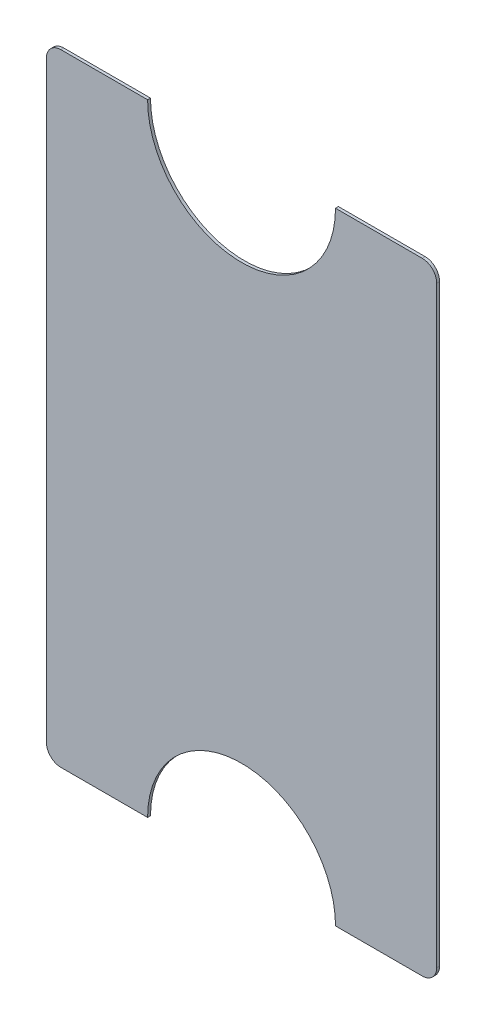
ISO-10303-21;
HEADER;
FILE_DESCRIPTION(('STEP AP214'),'2;1');
FILE_NAME('part.step','',(''),(''),'','','');
FILE_SCHEMA(('AUTOMOTIVE_DESIGN { 1 0 10303 214 1 1 1 1 }'));
ENDSEC;
DATA;
#1=APPLICATION_CONTEXT('core data for automotive mechanical design processes');
#2=APPLICATION_PROTOCOL_DEFINITION('international standard','automotive_design',2000,#1);
#3=PRODUCT_CONTEXT('',#1,'mechanical');
#4=PRODUCT('Part','Part','',(#3));
#5=PRODUCT_RELATED_PRODUCT_CATEGORY('part','',(#4));
#6=PRODUCT_DEFINITION_FORMATION('','',#4);
#7=PRODUCT_DEFINITION_CONTEXT('part definition',#1,'design');
#8=PRODUCT_DEFINITION('design','',#6,#7);
#9=PRODUCT_DEFINITION_SHAPE('','',#8);
#10=(LENGTH_UNIT() NAMED_UNIT(*) SI_UNIT(.MILLI.,.METRE.));
#11=(NAMED_UNIT(*) PLANE_ANGLE_UNIT() SI_UNIT($,.RADIAN.));
#12=(NAMED_UNIT(*) SI_UNIT($,.STERADIAN.) SOLID_ANGLE_UNIT());
#13=UNCERTAINTY_MEASURE_WITH_UNIT(LENGTH_MEASURE(1.E-05),#10,'distance_accuracy_value','');
#14=(GEOMETRIC_REPRESENTATION_CONTEXT(3) GLOBAL_UNCERTAINTY_ASSIGNED_CONTEXT((#13)) GLOBAL_UNIT_ASSIGNED_CONTEXT((#10,
#11,#12)) REPRESENTATION_CONTEXT('',''));
#15=CARTESIAN_POINT('',(0.,0.,0.));
#16=DIRECTION('',(0.,0.,1.));
#17=DIRECTION('',(1.,0.,0.));
#18=AXIS2_PLACEMENT_3D('',#15,#16,#17);
#19=CARTESIAN_POINT('',(-4.824993047503,-5.083004273851,0.43));
#20=DIRECTION('',(0.,0.,1.));
#21=DIRECTION('',(1.,0.,0.));
#22=AXIS2_PLACEMENT_3D('',#19,#20,#21);
#23=PLANE('',#22);
#24=CARTESIAN_POINT('',(-6.124993018382,-7.525000667453,0.43));
#25=DIRECTION('',(0.,0.,1.));
#26=DIRECTION('',(1.,0.,0.));
#27=AXIS2_PLACEMENT_3D('',#24,#25,#26);
#28=CIRCLE('',#27,0.05);
#29=CARTESIAN_POINT('',(-6.12499301778588,-7.57500066745288,0.43));
#30=VERTEX_POINT('',#29);
#31=CARTESIAN_POINT('',(-6.17499301838275,-7.52500066804912,0.43));
#32=VERTEX_POINT('',#31);
#33=EDGE_CURVE('E170',#30,#32,#28,.F.);
#34=ORIENTED_EDGE('',*,*,#33,.F.);
#35=DIRECTION('',(1.,1.19248806385E-08,0.));
#36=VECTOR('',#35,1.);
#37=CARTESIAN_POINT('',(-6.174993017786,-7.575000668049,0.43));
#38=LINE('',#37,#36);
#39=CARTESIAN_POINT('',(-5.824993017786,-7.57500066387529,0.43));
#40=VERTEX_POINT('',#39);
#41=EDGE_CURVE('E138',#40,#30,#38,.F.);
#42=ORIENTED_EDGE('',*,*,#41,.F.);
#43=CARTESIAN_POINT('',(-5.499993017786,-7.57500066,0.43));
#44=DIRECTION('',(0.,0.,1.));
#45=DIRECTION('',(1.,0.,0.));
#46=AXIS2_PLACEMENT_3D('',#43,#44,#45);
#47=CIRCLE('',#46,0.325);
#48=CARTESIAN_POINT('',(-5.174993017786,-7.57500065612406,0.43));
#49=VERTEX_POINT('',#48);
#50=EDGE_CURVE('E108',#40,#49,#47,.F.);
#51=ORIENTED_EDGE('',*,*,#50,.T.);
#52=DIRECTION('',(1.,0.,0.));
#53=VECTOR('',#52,1.);
#54=CARTESIAN_POINT('',(-4.824993047503,-7.575000656124,0.43));
#55=LINE('',#54,#53);
#56=CARTESIAN_POINT('',(-4.874993018084,-7.57500065433533,0.43));
#57=VERTEX_POINT('',#56);
#58=EDGE_CURVE('E109',#49,#57,#55,.T.);
#59=ORIENTED_EDGE('',*,*,#58,.T.);
#60=CARTESIAN_POINT('',(-4.874993018382,-7.525000652547,0.43));
#61=DIRECTION('',(0.,0.,1.));
#62=DIRECTION('',(1.,0.,0.));
#63=AXIS2_PLACEMENT_3D('',#60,#61,#62);
#64=CIRCLE('',#63,0.05);
#65=CARTESIAN_POINT('',(-4.82499301838212,-7.52500065224888,0.43));
#66=VERTEX_POINT('',#65);
#67=EDGE_CURVE('E20',#57,#66,#64,.T.);
#68=ORIENTED_EDGE('',*,*,#67,.T.);
#69=DIRECTION('',(-1.19248806385E-08,1.,0.));
#70=VECTOR('',#69,1.);
#71=CARTESIAN_POINT('',(-4.824993017786,-7.575000651951,0.43));
#72=LINE('',#71,#70);
#73=CARTESIAN_POINT('',(-4.82499304282825,-5.47500065195088,0.43));
#74=VERTEX_POINT('',#73);
#75=EDGE_CURVE('E124',#74,#66,#72,.F.);
#76=ORIENTED_EDGE('',*,*,#75,.F.);
#77=CARTESIAN_POINT('',(-4.874993042828,-5.475000652547,0.43));
#78=DIRECTION('',(0.,0.,1.));
#79=DIRECTION('',(1.,0.,0.));
#80=AXIS2_PLACEMENT_3D('',#77,#78,#79);
#81=CIRCLE('',#80,0.05);
#82=CARTESIAN_POINT('',(-4.87499304342462,-5.42500065254712,0.43));
#83=VERTEX_POINT('',#82);
#84=EDGE_CURVE('E162',#83,#74,#81,.F.);
#85=ORIENTED_EDGE('',*,*,#84,.F.);
#86=DIRECTION('',(-1.,-1.19248806385E-08,0.));
#87=VECTOR('',#86,1.);
#88=CARTESIAN_POINT('',(-4.824993043425,-5.425000651951,0.43));
#89=LINE('',#88,#87);
#90=CARTESIAN_POINT('',(-5.174993043425,-5.42500065612471,0.43));
#91=VERTEX_POINT('',#90);
#92=EDGE_CURVE('E126',#91,#83,#89,.F.);
#93=ORIENTED_EDGE('',*,*,#92,.F.);
#94=CARTESIAN_POINT('',(-5.499993043425,-5.42500066,0.43));
#95=DIRECTION('',(0.,0.,1.));
#96=DIRECTION('',(1.,0.,0.));
#97=AXIS2_PLACEMENT_3D('',#94,#95,#96);
#98=CIRCLE('',#97,0.325);
#99=CARTESIAN_POINT('',(-5.824993043425,-5.42500066387594,0.43));
#100=VERTEX_POINT('',#99);
#101=EDGE_CURVE('E165',#91,#100,#98,.F.);
#102=ORIENTED_EDGE('',*,*,#101,.T.);
#103=DIRECTION('',(-1.,-1.19248806385E-08,0.));
#104=VECTOR('',#103,1.);
#105=CARTESIAN_POINT('',(-4.824993043425,-5.425000651951,0.43));
#106=LINE('',#105,#104);
#107=CARTESIAN_POINT('',(-6.12499304342462,-5.42500066745334,0.43));
#108=VERTEX_POINT('',#107);
#109=EDGE_CURVE('E130',#108,#100,#106,.F.);
#110=ORIENTED_EDGE('',*,*,#109,.F.);
#111=CARTESIAN_POINT('',(-6.124993042828,-5.475000667453,0.43));
#112=DIRECTION('',(0.,0.,1.));
#113=DIRECTION('',(1.,0.,0.));
#114=AXIS2_PLACEMENT_3D('',#111,#112,#113);
#115=CIRCLE('',#114,0.05);
#116=CARTESIAN_POINT('',(-6.17499304282838,-5.47500066804912,0.43));
#117=VERTEX_POINT('',#116);
#118=EDGE_CURVE('E168',#117,#108,#115,.F.);
#119=ORIENTED_EDGE('',*,*,#118,.F.);
#120=DIRECTION('',(1.19248806385E-08,-1.,0.));
#121=VECTOR('',#120,1.);
#122=CARTESIAN_POINT('',(-6.174993043425,-5.425000668049,0.43));
#123=LINE('',#122,#121);
#124=EDGE_CURVE('E134',#32,#117,#123,.F.);
#125=ORIENTED_EDGE('',*,*,#124,.F.);
#126=EDGE_LOOP('',(#34,#42,#51,#59,#68,#76,#85,#93,#102,#110,#119,#125));
#127=FACE_BOUND('',#126,.T.);
#128=ADVANCED_FACE('F17',(#127),#23,.T.);
#129=CARTESIAN_POINT('',(-5.499993017786,-7.57500066,0.43));
#130=DIRECTION('',(0.,0.,1.));
#131=DIRECTION('',(1.,0.,0.));
#132=AXIS2_PLACEMENT_3D('',#129,#130,#131);
#133=CYLINDRICAL_SURFACE('',#132,0.325);
#134=DIRECTION('',(0.,0.,1.));
#135=VECTOR('',#134,1.);
#136=CARTESIAN_POINT('',(-5.824993017786,-7.57500066387529,0.));
#137=LINE('',#136,#135);
#138=CARTESIAN_POINT('',(-5.824993017786,-7.57500066387565,0.42));
#139=VERTEX_POINT('',#138);
#140=EDGE_CURVE('E141',#139,#40,#137,.T.);
#141=ORIENTED_EDGE('',*,*,#140,.F.);
#142=CARTESIAN_POINT('',(-5.499993017786,-7.57500066,0.42));
#143=DIRECTION('',(0.,0.,1.));
#144=DIRECTION('',(1.,0.,0.));
#145=AXIS2_PLACEMENT_3D('',#142,#143,#144);
#146=CIRCLE('',#145,0.325);
#147=CARTESIAN_POINT('',(-5.174993017786,-7.57500065433556,0.42));
#148=VERTEX_POINT('',#147);
#149=EDGE_CURVE('E115',#148,#139,#146,.T.);
#150=ORIENTED_EDGE('',*,*,#149,.F.);
#151=DIRECTION('',(0.,0.,1.));
#152=VECTOR('',#151,1.);
#153=CARTESIAN_POINT('',(-5.174993017786,-7.57500065612412,0.));
#154=LINE('',#153,#152);
#155=EDGE_CURVE('E116',#49,#148,#154,.F.);
#156=ORIENTED_EDGE('',*,*,#155,.F.);
#157=ORIENTED_EDGE('',*,*,#50,.F.);
#158=EDGE_LOOP('',(#141,#150,#156,#157));
#159=FACE_BOUND('',#158,.T.);
#160=ADVANCED_FACE('F235',(#159),#133,.F.);
#161=CARTESIAN_POINT('',(-6.174993017786,-7.575000668049,0.));
#162=DIRECTION('',(1.19248806385E-08,-1.,0.));
#163=DIRECTION('',(1.,1.19248806385E-08,0.));
#164=AXIS2_PLACEMENT_3D('',#161,#162,#163);
#165=PLANE('',#164);
#166=DIRECTION('',(0.,0.,1.));
#167=VECTOR('',#166,1.);
#168=CARTESIAN_POINT('',(-6.124993017786,-7.575000667453,0.));
#169=LINE('',#168,#167);
#170=CARTESIAN_POINT('',(-6.124993018084,-7.5750006656645,0.42));
#171=VERTEX_POINT('',#170);
#172=EDGE_CURVE('E140',#171,#30,#169,.T.);
#173=ORIENTED_EDGE('',*,*,#172,.F.);
#174=DIRECTION('',(-1.,0.,0.));
#175=VECTOR('',#174,1.);
#176=CARTESIAN_POINT('',(-4.824992989262,-7.575000663876,0.42));
#177=LINE('',#176,#175);
#178=EDGE_CURVE('E159',#139,#171,#177,.T.);
#179=ORIENTED_EDGE('',*,*,#178,.F.);
#180=ORIENTED_EDGE('',*,*,#140,.T.);
#181=ORIENTED_EDGE('',*,*,#41,.T.);
#182=EDGE_LOOP('',(#173,#179,#180,#181));
#183=FACE_BOUND('',#182,.T.);
#184=ADVANCED_FACE('F233',(#183),#165,.T.);
#185=CARTESIAN_POINT('',(-6.124993018382,-7.525000667453,0.));
#186=DIRECTION('',(0.,0.,1.));
#187=DIRECTION('',(1.,0.,0.));
#188=AXIS2_PLACEMENT_3D('',#185,#186,#187);
#189=CYLINDRICAL_SURFACE('',#188,0.05);
#190=ORIENTED_EDGE('',*,*,#33,.T.);
#191=DIRECTION('',(0.,0.,1.));
#192=VECTOR('',#191,1.);
#193=CARTESIAN_POINT('',(-6.17499301838275,-7.525000668049,0.));
#194=LINE('',#193,#192);
#195=CARTESIAN_POINT('',(-6.17499301838238,-7.525000667751,0.42));
#196=VERTEX_POINT('',#195);
#197=EDGE_CURVE('E137',#196,#32,#194,.T.);
#198=ORIENTED_EDGE('',*,*,#197,.F.);
#199=CARTESIAN_POINT('',(-6.124993018382,-7.525000667453,0.42));
#200=DIRECTION('',(0.,0.,1.));
#201=DIRECTION('',(1.,0.,0.));
#202=AXIS2_PLACEMENT_3D('',#199,#200,#201);
#203=CIRCLE('',#202,0.05);
#204=EDGE_CURVE('E156',#171,#196,#203,.F.);
#205=ORIENTED_EDGE('',*,*,#204,.F.);
#206=ORIENTED_EDGE('',*,*,#172,.T.);
#207=EDGE_LOOP('',(#190,#198,#205,#206));
#208=FACE_BOUND('',#207,.T.);
#209=ADVANCED_FACE('F232',(#208),#189,.T.);
#210=CARTESIAN_POINT('',(-6.174993043425,-5.425000668049,0.));
#211=DIRECTION('',(-1.,-1.19248806385E-08,0.));
#212=DIRECTION('',(1.19248806385E-08,-1.,0.));
#213=AXIS2_PLACEMENT_3D('',#210,#211,#212);
#214=PLANE('',#213);
#215=ORIENTED_EDGE('',*,*,#124,.T.);
#216=DIRECTION('',(0.,0.,1.));
#217=VECTOR('',#216,1.);
#218=CARTESIAN_POINT('',(-6.174993042828,-5.475000668049,0.));
#219=LINE('',#218,#217);
#220=CARTESIAN_POINT('',(-6.174993030605,-5.475000667751,0.42));
#221=VERTEX_POINT('',#220);
#222=EDGE_CURVE('E136',#221,#117,#219,.T.);
#223=ORIENTED_EDGE('',*,*,#222,.F.);
#224=DIRECTION('',(0.,1.,0.));
#225=VECTOR('',#224,1.);
#226=CARTESIAN_POINT('',(-6.174993018382,-9.966997030051,0.42));
#227=LINE('',#226,#225);
#228=EDGE_CURVE('E155',#196,#221,#227,.T.);
#229=ORIENTED_EDGE('',*,*,#228,.F.);
#230=ORIENTED_EDGE('',*,*,#197,.T.);
#231=EDGE_LOOP('',(#215,#223,#229,#230));
#232=FACE_BOUND('',#231,.T.);
#233=ADVANCED_FACE('F229',(#232),#214,.T.);
#234=CARTESIAN_POINT('',(-6.124993042828,-5.475000667453,0.));
#235=DIRECTION('',(0.,0.,1.));
#236=DIRECTION('',(1.,0.,0.));
#237=AXIS2_PLACEMENT_3D('',#234,#235,#236);
#238=CYLINDRICAL_SURFACE('',#237,0.05);
#239=ORIENTED_EDGE('',*,*,#118,.T.);
#240=DIRECTION('',(0.,0.,1.));
#241=VECTOR('',#240,1.);
#242=CARTESIAN_POINT('',(-6.124993043425,-5.42500066745334,0.));
#243=LINE('',#242,#241);
#244=CARTESIAN_POINT('',(-6.1249930431265,-5.42500066745317,0.42));
#245=VERTEX_POINT('',#244);
#246=EDGE_CURVE('E133',#245,#108,#243,.T.);
#247=ORIENTED_EDGE('',*,*,#246,.F.);
#248=CARTESIAN_POINT('',(-6.124993042828,-5.475000667453,0.42));
#249=DIRECTION('',(0.,0.,1.));
#250=DIRECTION('',(1.,0.,0.));
#251=AXIS2_PLACEMENT_3D('',#248,#249,#250);
#252=CIRCLE('',#251,0.05);
#253=EDGE_CURVE('E152',#221,#245,#252,.F.);
#254=ORIENTED_EDGE('',*,*,#253,.F.);
#255=ORIENTED_EDGE('',*,*,#222,.T.);
#256=EDGE_LOOP('',(#239,#247,#254,#255));
#257=FACE_BOUND('',#256,.T.);
#258=ADVANCED_FACE('F226',(#257),#238,.T.);
#259=CARTESIAN_POINT('',(-4.824993043425,-5.425000651951,0.));
#260=DIRECTION('',(-1.19248806385E-08,1.,0.));
#261=DIRECTION('',(-1.,-1.19248806385E-08,0.));
#262=AXIS2_PLACEMENT_3D('',#259,#260,#261);
#263=PLANE('',#262);
#264=ORIENTED_EDGE('',*,*,#246,.T.);
#265=ORIENTED_EDGE('',*,*,#109,.T.);
#266=DIRECTION('',(0.,0.,1.));
#267=VECTOR('',#266,1.);
#268=CARTESIAN_POINT('',(-5.824993043425,-5.425000663876,0.43));
#269=LINE('',#268,#267);
#270=CARTESIAN_POINT('',(-5.824993043425,-5.4250006656645,0.42));
#271=VERTEX_POINT('',#270);
#272=EDGE_CURVE('E132',#100,#271,#269,.F.);
#273=ORIENTED_EDGE('',*,*,#272,.T.);
#274=DIRECTION('',(-1.,0.,0.));
#275=VECTOR('',#274,1.);
#276=CARTESIAN_POINT('',(-4.824992989262,-5.425000667453,0.42));
#277=LINE('',#276,#275);
#278=EDGE_CURVE('E151',#245,#271,#277,.F.);
#279=ORIENTED_EDGE('',*,*,#278,.F.);
#280=EDGE_LOOP('',(#264,#265,#273,#279));
#281=FACE_BOUND('',#280,.T.);
#282=ADVANCED_FACE('F223',(#281),#263,.T.);
#283=CARTESIAN_POINT('',(-5.499993043425,-5.42500066,0.43));
#284=DIRECTION('',(0.,0.,1.));
#285=DIRECTION('',(1.,0.,0.));
#286=AXIS2_PLACEMENT_3D('',#283,#284,#285);
#287=CYLINDRICAL_SURFACE('',#286,0.325);
#288=DIRECTION('',(0.,0.,1.));
#289=VECTOR('',#288,1.);
#290=CARTESIAN_POINT('',(-5.174993043425,-5.42500065612471,0.));
#291=LINE('',#290,#289);
#292=CARTESIAN_POINT('',(-5.174993043425,-5.42500065612435,0.42));
#293=VERTEX_POINT('',#292);
#294=EDGE_CURVE('E129',#293,#91,#291,.T.);
#295=ORIENTED_EDGE('',*,*,#294,.F.);
#296=CARTESIAN_POINT('',(-5.499993043425,-5.42500066,0.42));
#297=DIRECTION('',(0.,0.,1.));
#298=DIRECTION('',(1.,0.,0.));
#299=AXIS2_PLACEMENT_3D('',#296,#297,#298);
#300=CIRCLE('',#299,0.325);
#301=EDGE_CURVE('E148',#271,#293,#300,.T.);
#302=ORIENTED_EDGE('',*,*,#301,.F.);
#303=ORIENTED_EDGE('',*,*,#272,.F.);
#304=ORIENTED_EDGE('',*,*,#101,.F.);
#305=EDGE_LOOP('',(#295,#302,#303,#304));
#306=FACE_BOUND('',#305,.T.);
#307=ADVANCED_FACE('F216',(#306),#287,.F.);
#308=CARTESIAN_POINT('',(-4.824993043425,-5.425000651951,0.));
#309=DIRECTION('',(-1.19248806385E-08,1.,0.));
#310=DIRECTION('',(-1.,-1.19248806385E-08,0.));
#311=AXIS2_PLACEMENT_3D('',#308,#309,#310);
#312=PLANE('',#311);
#313=DIRECTION('',(0.,0.,1.));
#314=VECTOR('',#313,1.);
#315=CARTESIAN_POINT('',(-4.874993043425,-5.425000652547,0.));
#316=LINE('',#315,#314);
#317=CARTESIAN_POINT('',(-4.8749930431265,-5.4250006543355,0.42));
#318=VERTEX_POINT('',#317);
#319=EDGE_CURVE('E128',#318,#83,#316,.T.);
#320=ORIENTED_EDGE('',*,*,#319,.F.);
#321=DIRECTION('',(-1.,0.,0.));
#322=VECTOR('',#321,1.);
#323=CARTESIAN_POINT('',(-4.824992989262,-5.425000656124,0.42));
#324=LINE('',#323,#322);
#325=EDGE_CURVE('E147',#293,#318,#324,.F.);
#326=ORIENTED_EDGE('',*,*,#325,.F.);
#327=ORIENTED_EDGE('',*,*,#294,.T.);
#328=ORIENTED_EDGE('',*,*,#92,.T.);
#329=EDGE_LOOP('',(#320,#326,#327,#328));
#330=FACE_BOUND('',#329,.T.);
#331=ADVANCED_FACE('F213',(#330),#312,.T.);
#332=CARTESIAN_POINT('',(-4.874993042828,-5.475000652547,0.));
#333=DIRECTION('',(0.,0.,1.));
#334=DIRECTION('',(1.,0.,0.));
#335=AXIS2_PLACEMENT_3D('',#332,#333,#334);
#336=CYLINDRICAL_SURFACE('',#335,0.05);
#337=ORIENTED_EDGE('',*,*,#84,.T.);
#338=DIRECTION('',(0.,0.,1.));
#339=VECTOR('',#338,1.);
#340=CARTESIAN_POINT('',(-4.82499304282825,-5.475000651951,0.));
#341=LINE('',#340,#339);
#342=CARTESIAN_POINT('',(-4.82499304282813,-5.475000652249,0.42));
#343=VERTEX_POINT('',#342);
#344=EDGE_CURVE('E164',#343,#74,#341,.T.);
#345=ORIENTED_EDGE('',*,*,#344,.F.);
#346=CARTESIAN_POINT('',(-4.874993042828,-5.475000652547,0.42));
#347=DIRECTION('',(0.,0.,1.));
#348=DIRECTION('',(1.,0.,0.));
#349=AXIS2_PLACEMENT_3D('',#346,#347,#348);
#350=CIRCLE('',#349,0.05);
#351=EDGE_CURVE('E144',#318,#343,#350,.F.);
#352=ORIENTED_EDGE('',*,*,#351,.F.);
#353=ORIENTED_EDGE('',*,*,#319,.T.);
#354=EDGE_LOOP('',(#337,#345,#352,#353));
#355=FACE_BOUND('',#354,.T.);
#356=ADVANCED_FACE('F210',(#355),#336,.T.);
#357=CARTESIAN_POINT('',(-4.824993017786,-7.575000651951,0.));
#358=DIRECTION('',(1.,1.19248806385E-08,0.));
#359=DIRECTION('',(-1.19248806385E-08,1.,0.));
#360=AXIS2_PLACEMENT_3D('',#357,#358,#359);
#361=PLANE('',#360);
#362=ORIENTED_EDGE('',*,*,#75,.T.);
#363=DIRECTION('',(0.,0.,1.));
#364=VECTOR('',#363,1.);
#365=CARTESIAN_POINT('',(-4.824993018382,-7.525000652547,0.));
#366=LINE('',#365,#364);
#367=CARTESIAN_POINT('',(-4.824993030605,-7.525000652547,0.42));
#368=VERTEX_POINT('',#367);
#369=EDGE_CURVE('E103',#368,#66,#366,.T.);
#370=ORIENTED_EDGE('',*,*,#369,.F.);
#371=DIRECTION('',(0.,1.,0.));
#372=VECTOR('',#371,1.);
#373=CARTESIAN_POINT('',(-4.824993042828,-9.966997030051,0.42));
#374=LINE('',#373,#372);
#375=EDGE_CURVE('E143',#343,#368,#374,.F.);
#376=ORIENTED_EDGE('',*,*,#375,.F.);
#377=ORIENTED_EDGE('',*,*,#344,.T.);
#378=EDGE_LOOP('',(#362,#370,#376,#377));
#379=FACE_BOUND('',#378,.T.);
#380=ADVANCED_FACE('F206',(#379),#361,.T.);
#381=CARTESIAN_POINT('',(-4.874993018382,-7.525000652547,0.));
#382=DIRECTION('',(0.,0.,1.));
#383=DIRECTION('',(1.,0.,0.));
#384=AXIS2_PLACEMENT_3D('',#381,#382,#383);
#385=CYLINDRICAL_SURFACE('',#384,0.05);
#386=ORIENTED_EDGE('',*,*,#67,.F.);
#387=DIRECTION('',(0.,0.,1.));
#388=VECTOR('',#387,1.);
#389=CARTESIAN_POINT('',(-4.874993017786,-7.57500065254666,0.));
#390=LINE('',#389,#388);
#391=CARTESIAN_POINT('',(-4.874993018084,-7.57500065254683,0.42));
#392=VERTEX_POINT('',#391);
#393=EDGE_CURVE('E35',#392,#57,#390,.T.);
#394=ORIENTED_EDGE('',*,*,#393,.F.);
#395=CARTESIAN_POINT('',(-4.874993018382,-7.525000652547,0.42));
#396=DIRECTION('',(0.,0.,1.));
#397=DIRECTION('',(1.,0.,0.));
#398=AXIS2_PLACEMENT_3D('',#395,#396,#397);
#399=CIRCLE('',#398,0.05);
#400=EDGE_CURVE('E26',#368,#392,#399,.F.);
#401=ORIENTED_EDGE('',*,*,#400,.F.);
#402=ORIENTED_EDGE('',*,*,#369,.T.);
#403=EDGE_LOOP('',(#386,#394,#401,#402));
#404=FACE_BOUND('',#403,.T.);
#405=ADVANCED_FACE('F102',(#404),#385,.T.);
#406=CARTESIAN_POINT('',(-6.174993017786,-7.575000668049,0.));
#407=DIRECTION('',(1.19248806385E-08,-1.,0.));
#408=DIRECTION('',(1.,1.19248806385E-08,0.));
#409=AXIS2_PLACEMENT_3D('',#406,#407,#408);
#410=PLANE('',#409);
#411=ORIENTED_EDGE('',*,*,#393,.T.);
#412=ORIENTED_EDGE('',*,*,#58,.F.);
#413=ORIENTED_EDGE('',*,*,#155,.T.);
#414=DIRECTION('',(-1.,0.,0.));
#415=VECTOR('',#414,1.);
#416=CARTESIAN_POINT('',(-4.824992989262,-7.575000652547,0.42));
#417=LINE('',#416,#415);
#418=EDGE_CURVE('E11',#392,#148,#417,.T.);
#419=ORIENTED_EDGE('',*,*,#418,.F.);
#420=EDGE_LOOP('',(#411,#412,#413,#419));
#421=FACE_BOUND('',#420,.T.);
#422=ADVANCED_FACE('F111',(#421),#410,.T.);
#423=CARTESIAN_POINT('',(-4.824992989262,-9.966997030051,0.42));
#424=DIRECTION('',(0.,0.,-1.));
#425=DIRECTION('',(-1.,0.,0.));
#426=AXIS2_PLACEMENT_3D('',#423,#424,#425);
#427=PLANE('',#426);
#428=ORIENTED_EDGE('',*,*,#400,.T.);
#429=ORIENTED_EDGE('',*,*,#418,.T.);
#430=ORIENTED_EDGE('',*,*,#149,.T.);
#431=ORIENTED_EDGE('',*,*,#178,.T.);
#432=ORIENTED_EDGE('',*,*,#204,.T.);
#433=ORIENTED_EDGE('',*,*,#228,.T.);
#434=ORIENTED_EDGE('',*,*,#253,.T.);
#435=ORIENTED_EDGE('',*,*,#278,.T.);
#436=ORIENTED_EDGE('',*,*,#301,.T.);
#437=ORIENTED_EDGE('',*,*,#325,.T.);
#438=ORIENTED_EDGE('',*,*,#351,.T.);
#439=ORIENTED_EDGE('',*,*,#375,.T.);
#440=EDGE_LOOP('',(#428,#429,#430,#431,#432,#433,#434,#435,#436,#437,#438,#439));
#441=FACE_BOUND('',#440,.T.);
#442=ADVANCED_FACE('F203',(#441),#427,.T.);
#443=CLOSED_SHELL('',(#128,#160,#184,#209,#233,#258,#282,#307,#331,#356,#380,#405,#422,#442));
#444=MANIFOLD_SOLID_BREP('B1',#443);
#445=ADVANCED_BREP_SHAPE_REPRESENTATION('',(#18,#444),#14);
#446=SHAPE_DEFINITION_REPRESENTATION(#9,#445);
ENDSEC;
END-ISO-10303-21;
